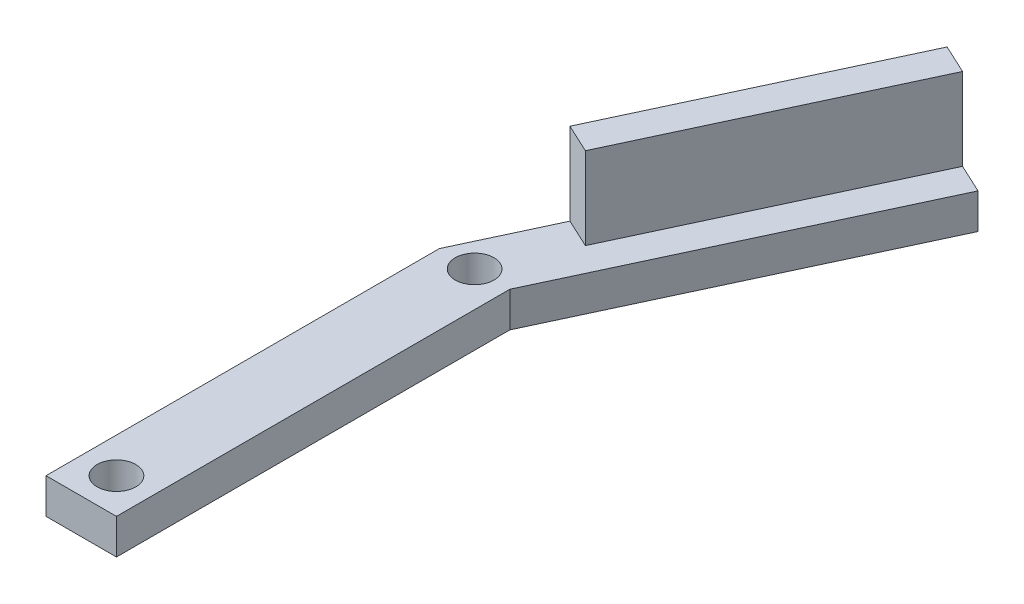
ISO-10303-21;
HEADER;
FILE_DESCRIPTION(('STEP AP214'),'2;1');
FILE_NAME('part.step','',(''),(''),'','','');
FILE_SCHEMA(('AUTOMOTIVE_DESIGN { 1 0 10303 214 1 1 1 1 }'));
ENDSEC;
DATA;
#1=APPLICATION_CONTEXT('core data for automotive mechanical design processes');
#2=APPLICATION_PROTOCOL_DEFINITION('international standard','automotive_design',2000,#1);
#3=PRODUCT_CONTEXT('',#1,'mechanical');
#4=PRODUCT('Part','Part','',(#3));
#5=PRODUCT_RELATED_PRODUCT_CATEGORY('part','',(#4));
#6=PRODUCT_DEFINITION_FORMATION('','',#4);
#7=PRODUCT_DEFINITION_CONTEXT('part definition',#1,'design');
#8=PRODUCT_DEFINITION('design','',#6,#7);
#9=PRODUCT_DEFINITION_SHAPE('','',#8);
#10=(LENGTH_UNIT() NAMED_UNIT(*) SI_UNIT(.MILLI.,.METRE.));
#11=(NAMED_UNIT(*) PLANE_ANGLE_UNIT() SI_UNIT($,.RADIAN.));
#12=(NAMED_UNIT(*) SI_UNIT($,.STERADIAN.) SOLID_ANGLE_UNIT());
#13=UNCERTAINTY_MEASURE_WITH_UNIT(LENGTH_MEASURE(1.E-05),#10,'distance_accuracy_value','');
#14=(GEOMETRIC_REPRESENTATION_CONTEXT(3) GLOBAL_UNCERTAINTY_ASSIGNED_CONTEXT((#13)) GLOBAL_UNIT_ASSIGNED_CONTEXT((#10,
#11,#12)) REPRESENTATION_CONTEXT('',''));
#15=CARTESIAN_POINT('',(0.,0.,0.));
#16=DIRECTION('',(0.,0.,1.));
#17=DIRECTION('',(1.,0.,0.));
#18=AXIS2_PLACEMENT_3D('',#15,#16,#17);
#19=CARTESIAN_POINT('',(-14.1463591720941,3.,-6.59655561695858));
#20=DIRECTION('',(0.906307787036652,0.,0.422618261740694));
#21=DIRECTION('',(0.422618261740694,0.,-0.906307787036653));
#22=AXIS2_PLACEMENT_3D('',#19,#20,#21);
#23=PLANE('',#22);
#24=DIRECTION('',(-0.422618261740694,0.,0.906307787036653));
#25=VECTOR('',#24,1.);
#26=CARTESIAN_POINT('',(-14.1463591720941,0.,-6.59655561695858));
#27=LINE('',#26,#25);
#28=CARTESIAN_POINT('',(10.7501850231612,0.,-59.9873669404565));
#29=VERTEX_POINT('',#28);
#30=CARTESIAN_POINT('',(-3.,0.,-30.5));
#31=VERTEX_POINT('',#30);
#32=EDGE_CURVE('E156',#29,#31,#27,.T.);
#33=ORIENTED_EDGE('',*,*,#32,.T.);
#34=DIRECTION('',(0.,-1.,0.));
#35=VECTOR('',#34,1.);
#36=CARTESIAN_POINT('',(-3.,3.,-30.5));
#37=LINE('',#36,#35);
#38=CARTESIAN_POINT('',(-3.,3.,-30.5));
#39=VERTEX_POINT('',#38);
#40=EDGE_CURVE('E11',#39,#31,#37,.T.);
#41=ORIENTED_EDGE('',*,*,#40,.F.);
#42=DIRECTION('',(-0.422618261740694,0.,0.906307787036653));
#43=VECTOR('',#42,1.);
#44=CARTESIAN_POINT('',(-14.1463591720941,3.,-6.59655561695858));
#45=LINE('',#44,#43);
#46=CARTESIAN_POINT('',(0.535818585470172,3.,-38.0825874262073));
#47=VERTEX_POINT('',#46);
#48=EDGE_CURVE('E82',#47,#39,#45,.T.);
#49=ORIENTED_EDGE('',*,*,#48,.F.);
#50=DIRECTION('',(0.,-1.,0.));
#51=VECTOR('',#50,1.);
#52=CARTESIAN_POINT('',(0.535818585470172,10.,-38.0825874262073));
#53=LINE('',#52,#51);
#54=CARTESIAN_POINT('',(0.535818585470172,10.,-38.0825874262073));
#55=VERTEX_POINT('',#54);
#56=EDGE_CURVE('E131',#55,#47,#53,.T.);
#57=ORIENTED_EDGE('',*,*,#56,.F.);
#58=DIRECTION('',(-0.422618261740694,0.,0.906307787036653));
#59=VECTOR('',#58,1.);
#60=CARTESIAN_POINT('',(-14.1463591720941,10.,-6.59655561695858));
#61=LINE('',#60,#59);
#62=CARTESIAN_POINT('',(10.7501850231612,10.,-59.9873669404565));
#63=VERTEX_POINT('',#62);
#64=EDGE_CURVE('E317',#63,#55,#61,.T.);
#65=ORIENTED_EDGE('',*,*,#64,.F.);
#66=DIRECTION('',(0.,-1.,0.));
#67=VECTOR('',#66,1.);
#68=CARTESIAN_POINT('',(10.7501850231612,10.,-59.9873669404565));
#69=LINE('',#68,#67);
#70=EDGE_CURVE('E126',#63,#29,#69,.T.);
#71=ORIENTED_EDGE('',*,*,#70,.T.);
#72=EDGE_LOOP('',(#33,#41,#49,#57,#65,#71));
#73=FACE_BOUND('',#72,.T.);
#74=ADVANCED_FACE('F36',(#73),#23,.F.);
#75=CARTESIAN_POINT('',(-3.,3.,0.));
#76=DIRECTION('',(-1.,0.,0.));
#77=DIRECTION('',(0.,0.,1.));
#78=AXIS2_PLACEMENT_3D('',#75,#76,#77);
#79=PLANE('',#78);
#80=DIRECTION('',(0.,0.,-1.));
#81=VECTOR('',#80,1.);
#82=CARTESIAN_POINT('',(-3.,0.,0.));
#83=LINE('',#82,#81);
#84=CARTESIAN_POINT('',(-3.,0.,3.));
#85=VERTEX_POINT('',#84);
#86=EDGE_CURVE('E159',#85,#31,#83,.T.);
#87=ORIENTED_EDGE('',*,*,#86,.F.);
#88=DIRECTION('',(0.,-1.,0.));
#89=VECTOR('',#88,1.);
#90=CARTESIAN_POINT('',(-3.,3.,3.));
#91=LINE('',#90,#89);
#92=CARTESIAN_POINT('',(-3.,3.,3.));
#93=VERTEX_POINT('',#92);
#94=EDGE_CURVE('E45',#93,#85,#91,.T.);
#95=ORIENTED_EDGE('',*,*,#94,.F.);
#96=DIRECTION('',(0.,0.,-1.));
#97=VECTOR('',#96,1.);
#98=CARTESIAN_POINT('',(-3.,3.,0.));
#99=LINE('',#98,#97);
#100=EDGE_CURVE('E140',#93,#39,#99,.T.);
#101=ORIENTED_EDGE('',*,*,#100,.T.);
#102=ORIENTED_EDGE('',*,*,#40,.T.);
#103=EDGE_LOOP('',(#87,#95,#101,#102));
#104=FACE_BOUND('',#103,.T.);
#105=ADVANCED_FACE('F188',(#104),#79,.T.);
#106=CARTESIAN_POINT('',(0.,3.,3.));
#107=DIRECTION('',(0.,0.,-1.));
#108=DIRECTION('',(-1.,0.,0.));
#109=AXIS2_PLACEMENT_3D('',#106,#107,#108);
#110=PLANE('',#109);
#111=DIRECTION('',(1.,0.,0.));
#112=VECTOR('',#111,1.);
#113=CARTESIAN_POINT('',(0.,0.,3.));
#114=LINE('',#113,#112);
#115=CARTESIAN_POINT('',(3.,0.,3.));
#116=VERTEX_POINT('',#115);
#117=EDGE_CURVE('E162',#85,#116,#114,.T.);
#118=ORIENTED_EDGE('',*,*,#117,.T.);
#119=DIRECTION('',(0.,-1.,0.));
#120=VECTOR('',#119,1.);
#121=CARTESIAN_POINT('',(3.,3.,3.));
#122=LINE('',#121,#120);
#123=CARTESIAN_POINT('',(3.,3.,3.));
#124=VERTEX_POINT('',#123);
#125=EDGE_CURVE('E175',#124,#116,#122,.T.);
#126=ORIENTED_EDGE('',*,*,#125,.F.);
#127=DIRECTION('',(1.,0.,0.));
#128=VECTOR('',#127,1.);
#129=CARTESIAN_POINT('',(0.,3.,3.));
#130=LINE('',#129,#128);
#131=EDGE_CURVE('E143',#93,#124,#130,.T.);
#132=ORIENTED_EDGE('',*,*,#131,.F.);
#133=ORIENTED_EDGE('',*,*,#94,.T.);
#134=EDGE_LOOP('',(#118,#126,#132,#133));
#135=FACE_BOUND('',#134,.T.);
#136=ADVANCED_FACE('F179',(#135),#110,.F.);
#137=CARTESIAN_POINT('',(3.,3.,0.));
#138=DIRECTION('',(1.,0.,0.));
#139=DIRECTION('',(0.,0.,-1.));
#140=AXIS2_PLACEMENT_3D('',#137,#138,#139);
#141=PLANE('',#140);
#142=DIRECTION('',(0.,0.,1.));
#143=VECTOR('',#142,1.);
#144=CARTESIAN_POINT('',(3.,0.,0.));
#145=LINE('',#144,#143);
#146=CARTESIAN_POINT('',(3.,0.,-30.5));
#147=VERTEX_POINT('',#146);
#148=EDGE_CURVE('E165',#147,#116,#145,.T.);
#149=ORIENTED_EDGE('',*,*,#148,.F.);
#150=DIRECTION('',(0.,-1.,0.));
#151=VECTOR('',#150,1.);
#152=CARTESIAN_POINT('',(3.,3.,-30.5));
#153=LINE('',#152,#151);
#154=CARTESIAN_POINT('',(3.,3.,-30.5));
#155=VERTEX_POINT('',#154);
#156=EDGE_CURVE('E73',#155,#147,#153,.T.);
#157=ORIENTED_EDGE('',*,*,#156,.F.);
#158=DIRECTION('',(0.,0.,1.));
#159=VECTOR('',#158,1.);
#160=CARTESIAN_POINT('',(3.,3.,0.));
#161=LINE('',#160,#159);
#162=EDGE_CURVE('E145',#155,#124,#161,.T.);
#163=ORIENTED_EDGE('',*,*,#162,.T.);
#164=ORIENTED_EDGE('',*,*,#125,.T.);
#165=EDGE_LOOP('',(#149,#157,#163,#164));
#166=FACE_BOUND('',#165,.T.);
#167=ADVANCED_FACE('F196',(#166),#141,.T.);
#168=CARTESIAN_POINT('',(-9.21799634303446,3.,-4.29842228760167));
#169=DIRECTION('',(-0.906307787036653,0.,-0.422618261740693));
#170=DIRECTION('',(-0.422618261740693,0.,0.906307787036653));
#171=AXIS2_PLACEMENT_3D('',#168,#169,#170);
#172=PLANE('',#171);
#173=DIRECTION('',(0.422618261740694,0.,-0.906307787036653));
#174=VECTOR('',#173,1.);
#175=CARTESIAN_POINT('',(-9.21799634303446,0.,-4.29842228760167));
#176=LINE('',#175,#174);
#177=CARTESIAN_POINT('',(15.6785478522208,0.,-57.6892336110996));
#178=VERTEX_POINT('',#177);
#179=EDGE_CURVE('E77',#147,#178,#176,.T.);
#180=ORIENTED_EDGE('',*,*,#179,.T.);
#181=DIRECTION('',(0.,-1.,0.));
#182=VECTOR('',#181,1.);
#183=CARTESIAN_POINT('',(15.6785478522208,3.,-57.6892336110996));
#184=LINE('',#183,#182);
#185=CARTESIAN_POINT('',(15.6785478522208,3.,-57.6892336110996));
#186=VERTEX_POINT('',#185);
#187=EDGE_CURVE('E153',#186,#178,#184,.T.);
#188=ORIENTED_EDGE('',*,*,#187,.F.);
#189=DIRECTION('',(0.422618261740694,0.,-0.906307787036653));
#190=VECTOR('',#189,1.);
#191=CARTESIAN_POINT('',(-9.21799634303446,3.,-4.29842228760167));
#192=LINE('',#191,#190);
#193=EDGE_CURVE('E105',#155,#186,#192,.T.);
#194=ORIENTED_EDGE('',*,*,#193,.F.);
#195=ORIENTED_EDGE('',*,*,#156,.T.);
#196=EDGE_LOOP('',(#180,#188,#194,#195));
#197=FACE_BOUND('',#196,.T.);
#198=ADVANCED_FACE('F194',(#197),#172,.F.);
#199=CARTESIAN_POINT('',(24.8965441952553,3.,-53.3908113234979));
#200=DIRECTION('',(-0.422618261740693,0.,0.906307787036653));
#201=DIRECTION('',(0.906307787036653,0.,0.422618261740694));
#202=AXIS2_PLACEMENT_3D('',#199,#200,#201);
#203=PLANE('',#202);
#204=DIRECTION('',(-0.906307787036653,0.,-0.422618261740693));
#205=VECTOR('',#204,1.);
#206=CARTESIAN_POINT('',(24.8965441952553,0.,-53.3908113234979));
#207=LINE('',#206,#205);
#208=EDGE_CURVE('E169',#178,#29,#207,.T.);
#209=ORIENTED_EDGE('',*,*,#208,.T.);
#210=ORIENTED_EDGE('',*,*,#70,.F.);
#211=DIRECTION('',(-0.906307787036653,0.,-0.422618261740693));
#212=VECTOR('',#211,1.);
#213=CARTESIAN_POINT('',(24.8965441952553,10.,-53.3908113234979));
#214=LINE('',#213,#212);
#215=CARTESIAN_POINT('',(13.214366437691,10.,-58.838300275778));
#216=VERTEX_POINT('',#215);
#217=EDGE_CURVE('E124',#216,#63,#214,.T.);
#218=ORIENTED_EDGE('',*,*,#217,.F.);
#219=DIRECTION('',(0.,-1.,0.));
#220=VECTOR('',#219,1.);
#221=CARTESIAN_POINT('',(13.214366437691,10.,-58.838300275778));
#222=LINE('',#221,#220);
#223=CARTESIAN_POINT('',(13.214366437691,3.,-58.838300275778));
#224=VERTEX_POINT('',#223);
#225=EDGE_CURVE('E115',#216,#224,#222,.T.);
#226=ORIENTED_EDGE('',*,*,#225,.T.);
#227=DIRECTION('',(-0.906307787036653,0.,-0.422618261740693));
#228=VECTOR('',#227,1.);
#229=CARTESIAN_POINT('',(24.8965441952553,3.,-53.3908113234979));
#230=LINE('',#229,#228);
#231=EDGE_CURVE('E99',#186,#224,#230,.T.);
#232=ORIENTED_EDGE('',*,*,#231,.F.);
#233=ORIENTED_EDGE('',*,*,#187,.T.);
#234=EDGE_LOOP('',(#209,#210,#218,#226,#232,#233));
#235=FACE_BOUND('',#234,.T.);
#236=ADVANCED_FACE('F121',(#235),#203,.F.);
#237=CARTESIAN_POINT('',(0.,3.,-30.5));
#238=DIRECTION('',(0.,-1.,0.));
#239=DIRECTION('',(0.,0.,-1.));
#240=AXIS2_PLACEMENT_3D('',#237,#238,#239);
#241=CYLINDRICAL_SURFACE('',#240,1.65);
#242=CARTESIAN_POINT('',(0.,3.,-30.5));
#243=DIRECTION('',(0.,1.,0.));
#244=DIRECTION('',(0.,0.,1.));
#245=AXIS2_PLACEMENT_3D('',#242,#243,#244);
#246=CIRCLE('',#245,1.65);
#247=CARTESIAN_POINT('',(0.,3.,-28.85));
#248=VERTEX_POINT('',#247);
#249=EDGE_CURVE('E135',#248,#248,#246,.T.);
#250=ORIENTED_EDGE('',*,*,#249,.T.);
#251=EDGE_LOOP('',(#250));
#252=FACE_BOUND('',#251,.T.);
#253=CARTESIAN_POINT('',(0.,0.,-30.5));
#254=DIRECTION('',(0.,1.,0.));
#255=DIRECTION('',(0.,0.,1.));
#256=AXIS2_PLACEMENT_3D('',#253,#254,#255);
#257=CIRCLE('',#256,1.65);
#258=CARTESIAN_POINT('',(0.,0.,-28.85));
#259=VERTEX_POINT('',#258);
#260=EDGE_CURVE('E128',#259,#259,#257,.T.);
#261=ORIENTED_EDGE('',*,*,#260,.F.);
#262=EDGE_LOOP('',(#261));
#263=FACE_BOUND('',#262,.T.);
#264=ADVANCED_FACE('F38',(#252,#263),#241,.F.);
#265=CARTESIAN_POINT('',(0.,3.,0.));
#266=DIRECTION('',(0.,-1.,0.));
#267=DIRECTION('',(0.,0.,-1.));
#268=AXIS2_PLACEMENT_3D('',#265,#266,#267);
#269=CYLINDRICAL_SURFACE('',#268,1.65);
#270=CARTESIAN_POINT('',(0.,3.,0.));
#271=DIRECTION('',(0.,1.,0.));
#272=DIRECTION('',(0.,0.,1.));
#273=AXIS2_PLACEMENT_3D('',#270,#271,#272);
#274=CIRCLE('',#273,1.65);
#275=CARTESIAN_POINT('',(0.,3.,1.65));
#276=VERTEX_POINT('',#275);
#277=EDGE_CURVE('E150',#276,#276,#274,.T.);
#278=ORIENTED_EDGE('',*,*,#277,.T.);
#279=EDGE_LOOP('',(#278));
#280=FACE_BOUND('',#279,.T.);
#281=CARTESIAN_POINT('',(0.,0.,0.));
#282=DIRECTION('',(0.,1.,0.));
#283=DIRECTION('',(0.,0.,1.));
#284=AXIS2_PLACEMENT_3D('',#281,#282,#283);
#285=CIRCLE('',#284,1.65);
#286=CARTESIAN_POINT('',(0.,0.,1.65));
#287=VERTEX_POINT('',#286);
#288=EDGE_CURVE('E138',#287,#287,#285,.T.);
#289=ORIENTED_EDGE('',*,*,#288,.F.);
#290=EDGE_LOOP('',(#289));
#291=FACE_BOUND('',#290,.T.);
#292=ADVANCED_FACE('F238',(#280,#291),#269,.F.);
#293=CARTESIAN_POINT('',(0.,3.,0.));
#294=DIRECTION('',(0.,1.,0.));
#295=DIRECTION('',(0.,0.,1.));
#296=AXIS2_PLACEMENT_3D('',#293,#294,#295);
#297=PLANE('',#296);
#298=ORIENTED_EDGE('',*,*,#249,.F.);
#299=EDGE_LOOP('',(#298));
#300=FACE_BOUND('',#299,.T.);
#301=ORIENTED_EDGE('',*,*,#48,.T.);
#302=ORIENTED_EDGE('',*,*,#100,.F.);
#303=ORIENTED_EDGE('',*,*,#131,.T.);
#304=ORIENTED_EDGE('',*,*,#162,.F.);
#305=ORIENTED_EDGE('',*,*,#193,.T.);
#306=ORIENTED_EDGE('',*,*,#231,.T.);
#307=DIRECTION('',(-0.422618261740694,0.,0.906307787036653));
#308=VECTOR('',#307,1.);
#309=CARTESIAN_POINT('',(-11.6821777575643,3.,-5.44748895228012));
#310=LINE('',#309,#308);
#311=CARTESIAN_POINT('',(3.,3.,-36.9335207615288));
#312=VERTEX_POINT('',#311);
#313=EDGE_CURVE('E103',#224,#312,#310,.T.);
#314=ORIENTED_EDGE('',*,*,#313,.T.);
#315=DIRECTION('',(-0.906307787036653,0.,-0.422618261740693));
#316=VECTOR('',#315,1.);
#317=CARTESIAN_POINT('',(14.6821777575643,3.,-31.4860318092487));
#318=LINE('',#317,#316);
#319=EDGE_CURVE('E53',#312,#47,#318,.T.);
#320=ORIENTED_EDGE('',*,*,#319,.T.);
#321=EDGE_LOOP('',(#301,#302,#303,#304,#305,#306,#314,#320));
#322=FACE_BOUND('',#321,.T.);
#323=ORIENTED_EDGE('',*,*,#277,.F.);
#324=EDGE_LOOP('',(#323));
#325=FACE_BOUND('',#324,.T.);
#326=ADVANCED_FACE('F101',(#300,#322,#325),#297,.T.);
#327=CARTESIAN_POINT('',(0.,0.,0.));
#328=DIRECTION('',(0.,1.,0.));
#329=DIRECTION('',(0.,0.,1.));
#330=AXIS2_PLACEMENT_3D('',#327,#328,#329);
#331=PLANE('',#330);
#332=ORIENTED_EDGE('',*,*,#32,.F.);
#333=ORIENTED_EDGE('',*,*,#208,.F.);
#334=ORIENTED_EDGE('',*,*,#179,.F.);
#335=ORIENTED_EDGE('',*,*,#148,.T.);
#336=ORIENTED_EDGE('',*,*,#117,.F.);
#337=ORIENTED_EDGE('',*,*,#86,.T.);
#338=EDGE_LOOP('',(#332,#333,#334,#335,#336,#337));
#339=FACE_BOUND('',#338,.T.);
#340=ORIENTED_EDGE('',*,*,#260,.T.);
#341=EDGE_LOOP('',(#340));
#342=FACE_BOUND('',#341,.T.);
#343=ORIENTED_EDGE('',*,*,#288,.T.);
#344=EDGE_LOOP('',(#343));
#345=FACE_BOUND('',#344,.T.);
#346=ADVANCED_FACE('F185',(#339,#342,#345),#331,.F.);
#347=CARTESIAN_POINT('',(14.6821777575643,10.,-31.4860318092487));
#348=DIRECTION('',(-0.422618261740693,0.,0.906307787036653));
#349=DIRECTION('',(0.906307787036653,0.,0.422618261740693));
#350=AXIS2_PLACEMENT_3D('',#347,#348,#349);
#351=PLANE('',#350);
#352=ORIENTED_EDGE('',*,*,#56,.T.);
#353=ORIENTED_EDGE('',*,*,#319,.F.);
#354=DIRECTION('',(0.,-1.,0.));
#355=VECTOR('',#354,1.);
#356=CARTESIAN_POINT('',(3.,10.,-36.9335207615288));
#357=LINE('',#356,#355);
#358=CARTESIAN_POINT('',(3.,10.,-36.9335207615288));
#359=VERTEX_POINT('',#358);
#360=EDGE_CURVE('E118',#359,#312,#357,.T.);
#361=ORIENTED_EDGE('',*,*,#360,.F.);
#362=DIRECTION('',(-0.906307787036653,0.,-0.422618261740693));
#363=VECTOR('',#362,1.);
#364=CARTESIAN_POINT('',(14.6821777575643,10.,-31.4860318092487));
#365=LINE('',#364,#363);
#366=EDGE_CURVE('E315',#359,#55,#365,.T.);
#367=ORIENTED_EDGE('',*,*,#366,.T.);
#368=EDGE_LOOP('',(#352,#353,#361,#367));
#369=FACE_BOUND('',#368,.T.);
#370=ADVANCED_FACE('F281',(#369),#351,.T.);
#371=CARTESIAN_POINT('',(-11.6821777575643,10.,-5.44748895228012));
#372=DIRECTION('',(0.906307787036653,0.,0.422618261740694));
#373=DIRECTION('',(0.422618261740694,0.,-0.906307787036653));
#374=AXIS2_PLACEMENT_3D('',#371,#372,#373);
#375=PLANE('',#374);
#376=ORIENTED_EDGE('',*,*,#360,.T.);
#377=ORIENTED_EDGE('',*,*,#313,.F.);
#378=ORIENTED_EDGE('',*,*,#225,.F.);
#379=DIRECTION('',(-0.422618261740694,0.,0.906307787036653));
#380=VECTOR('',#379,1.);
#381=CARTESIAN_POINT('',(-11.6821777575643,10.,-5.44748895228012));
#382=LINE('',#381,#380);
#383=EDGE_CURVE('E316',#216,#359,#382,.T.);
#384=ORIENTED_EDGE('',*,*,#383,.T.);
#385=EDGE_LOOP('',(#376,#377,#378,#384));
#386=FACE_BOUND('',#385,.T.);
#387=ADVANCED_FACE('F112',(#386),#375,.T.);
#388=CARTESIAN_POINT('',(0.,10.,0.));
#389=DIRECTION('',(0.,1.,0.));
#390=DIRECTION('',(0.,0.,1.));
#391=AXIS2_PLACEMENT_3D('',#388,#389,#390);
#392=PLANE('',#391);
#393=ORIENTED_EDGE('',*,*,#366,.F.);
#394=ORIENTED_EDGE('',*,*,#383,.F.);
#395=ORIENTED_EDGE('',*,*,#217,.T.);
#396=ORIENTED_EDGE('',*,*,#64,.T.);
#397=EDGE_LOOP('',(#393,#394,#395,#396));
#398=FACE_BOUND('',#397,.T.);
#399=ADVANCED_FACE('F299',(#398),#392,.T.);
#400=CLOSED_SHELL('',(#74,#105,#136,#167,#198,#236,#264,#292,#326,#346,#370,#387,#399));
#401=MANIFOLD_SOLID_BREP('B2',#400);
#402=ADVANCED_BREP_SHAPE_REPRESENTATION('',(#18,#401),#14);
#403=SHAPE_DEFINITION_REPRESENTATION(#9,#402);
ENDSEC;
END-ISO-10303-21;
